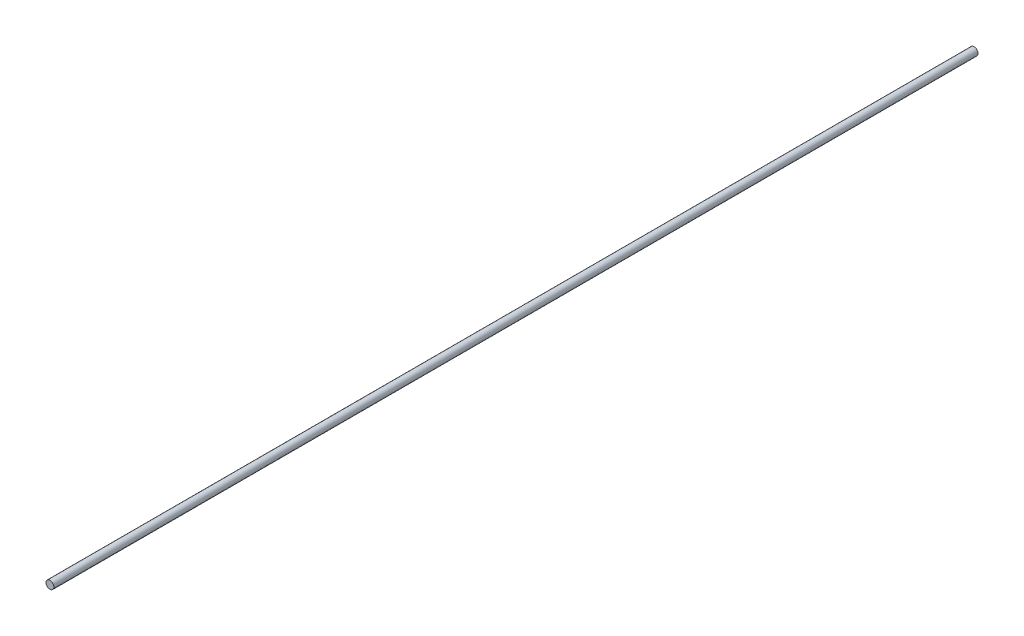
ISO-10303-21;
HEADER;
FILE_DESCRIPTION(('STEP AP214'),'2;1');
FILE_NAME('part.step','',(''),(''),'','','');
FILE_SCHEMA(('AUTOMOTIVE_DESIGN { 1 0 10303 214 1 1 1 1 }'));
ENDSEC;
DATA;
#1=APPLICATION_CONTEXT('core data for automotive mechanical design processes');
#2=APPLICATION_PROTOCOL_DEFINITION('international standard','automotive_design',2000,#1);
#3=PRODUCT_CONTEXT('',#1,'mechanical');
#4=PRODUCT('Part','Part','',(#3));
#5=PRODUCT_RELATED_PRODUCT_CATEGORY('part','',(#4));
#6=PRODUCT_DEFINITION_FORMATION('','',#4);
#7=PRODUCT_DEFINITION_CONTEXT('part definition',#1,'design');
#8=PRODUCT_DEFINITION('design','',#6,#7);
#9=PRODUCT_DEFINITION_SHAPE('','',#8);
#10=(LENGTH_UNIT() NAMED_UNIT(*) SI_UNIT(.MILLI.,.METRE.));
#11=(NAMED_UNIT(*) PLANE_ANGLE_UNIT() SI_UNIT($,.RADIAN.));
#12=(NAMED_UNIT(*) SI_UNIT($,.STERADIAN.) SOLID_ANGLE_UNIT());
#13=UNCERTAINTY_MEASURE_WITH_UNIT(LENGTH_MEASURE(1.E-05),#10,'distance_accuracy_value','');
#14=(GEOMETRIC_REPRESENTATION_CONTEXT(3) GLOBAL_UNCERTAINTY_ASSIGNED_CONTEXT((#13)) GLOBAL_UNIT_ASSIGNED_CONTEXT((#10,
#11,#12)) REPRESENTATION_CONTEXT('',''));
#15=CARTESIAN_POINT('',(0.,0.,0.));
#16=DIRECTION('',(0.,0.,1.));
#17=DIRECTION('',(1.,0.,0.));
#18=AXIS2_PLACEMENT_3D('',#15,#16,#17);
#19=CARTESIAN_POINT('',(0.,0.,944.85));
#20=DIRECTION('',(0.,0.,-1.));
#21=DIRECTION('',(-1.,0.,0.));
#22=AXIS2_PLACEMENT_3D('',#19,#20,#21);
#23=CYLINDRICAL_SURFACE('',#22,4.);
#24=CARTESIAN_POINT('',(0.,0.,944.85));
#25=DIRECTION('',(0.,0.,1.));
#26=DIRECTION('',(1.,0.,0.));
#27=AXIS2_PLACEMENT_3D('',#24,#25,#26);
#28=CIRCLE('',#27,4.);
#29=CARTESIAN_POINT('',(4.,0.,944.85));
#30=VERTEX_POINT('',#29);
#31=EDGE_CURVE('E10',#30,#30,#28,.T.);
#32=ORIENTED_EDGE('',*,*,#31,.F.);
#33=EDGE_LOOP('',(#32));
#34=FACE_BOUND('',#33,.T.);
#35=CARTESIAN_POINT('',(0.,0.,0.));
#36=DIRECTION('',(0.,0.,1.));
#37=DIRECTION('',(1.,0.,0.));
#38=AXIS2_PLACEMENT_3D('',#35,#36,#37);
#39=CIRCLE('',#38,4.);
#40=CARTESIAN_POINT('',(4.,0.,0.));
#41=VERTEX_POINT('',#40);
#42=EDGE_CURVE('E39',#41,#41,#39,.T.);
#43=ORIENTED_EDGE('',*,*,#42,.T.);
#44=EDGE_LOOP('',(#43));
#45=FACE_BOUND('',#44,.T.);
#46=ADVANCED_FACE('F36',(#34,#45),#23,.T.);
#47=CARTESIAN_POINT('',(0.,0.,944.85));
#48=DIRECTION('',(0.,0.,1.));
#49=DIRECTION('',(1.,0.,0.));
#50=AXIS2_PLACEMENT_3D('',#47,#48,#49);
#51=PLANE('',#50);
#52=ORIENTED_EDGE('',*,*,#31,.T.);
#53=EDGE_LOOP('',(#52));
#54=FACE_BOUND('',#53,.T.);
#55=ADVANCED_FACE('F51',(#54),#51,.T.);
#56=CARTESIAN_POINT('',(0.,0.,0.));
#57=DIRECTION('',(0.,0.,1.));
#58=DIRECTION('',(1.,0.,0.));
#59=AXIS2_PLACEMENT_3D('',#56,#57,#58);
#60=PLANE('',#59);
#61=ORIENTED_EDGE('',*,*,#42,.F.);
#62=EDGE_LOOP('',(#61));
#63=FACE_BOUND('',#62,.T.);
#64=ADVANCED_FACE('F49',(#63),#60,.F.);
#65=CLOSED_SHELL('',(#46,#55,#64));
#66=MANIFOLD_SOLID_BREP('B2',#65);
#67=ADVANCED_BREP_SHAPE_REPRESENTATION('',(#18,#66),#14);
#68=SHAPE_DEFINITION_REPRESENTATION(#9,#67);
ENDSEC;
END-ISO-10303-21;
